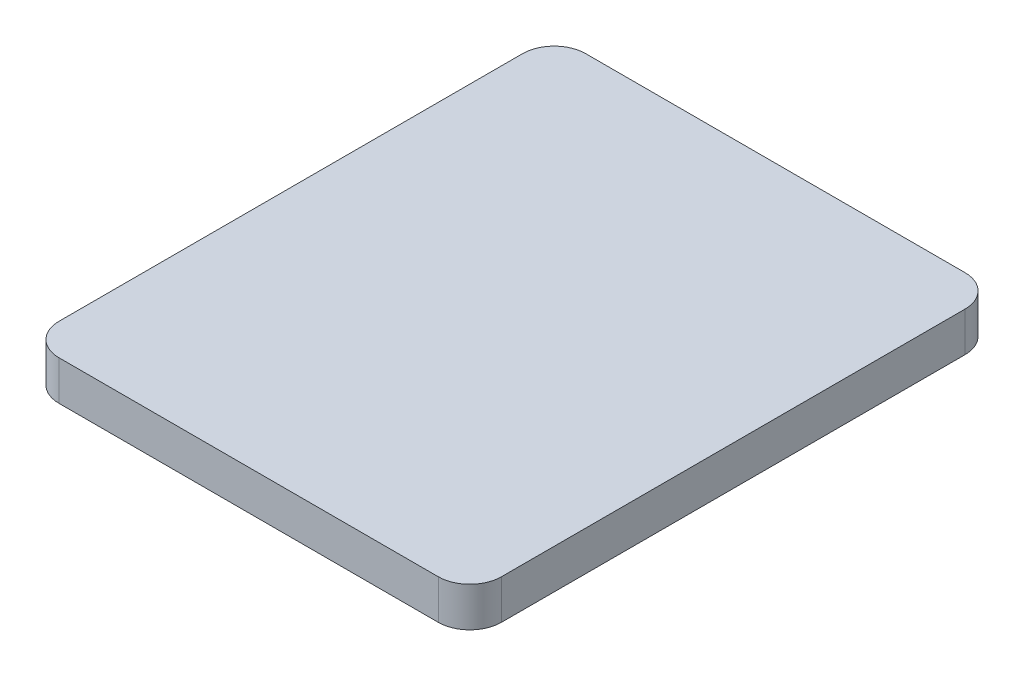
ISO-10303-21;
HEADER;
FILE_DESCRIPTION(('STEP AP214'),'2;1');
FILE_NAME('part.step','',(''),(''),'','','');
FILE_SCHEMA(('AUTOMOTIVE_DESIGN { 1 0 10303 214 1 1 1 1 }'));
ENDSEC;
DATA;
#1=APPLICATION_CONTEXT('core data for automotive mechanical design processes');
#2=APPLICATION_PROTOCOL_DEFINITION('international standard','automotive_design',2000,#1);
#3=PRODUCT_CONTEXT('',#1,'mechanical');
#4=PRODUCT('Part','Part','',(#3));
#5=PRODUCT_RELATED_PRODUCT_CATEGORY('part','',(#4));
#6=PRODUCT_DEFINITION_FORMATION('','',#4);
#7=PRODUCT_DEFINITION_CONTEXT('part definition',#1,'design');
#8=PRODUCT_DEFINITION('design','',#6,#7);
#9=PRODUCT_DEFINITION_SHAPE('','',#8);
#10=(LENGTH_UNIT() NAMED_UNIT(*) SI_UNIT(.MILLI.,.METRE.));
#11=(NAMED_UNIT(*) PLANE_ANGLE_UNIT() SI_UNIT($,.RADIAN.));
#12=(NAMED_UNIT(*) SI_UNIT($,.STERADIAN.) SOLID_ANGLE_UNIT());
#13=UNCERTAINTY_MEASURE_WITH_UNIT(LENGTH_MEASURE(1.E-05),#10,'distance_accuracy_value','');
#14=(GEOMETRIC_REPRESENTATION_CONTEXT(3) GLOBAL_UNCERTAINTY_ASSIGNED_CONTEXT((#13)) GLOBAL_UNIT_ASSIGNED_CONTEXT((#10,
#11,#12)) REPRESENTATION_CONTEXT('',''));
#15=CARTESIAN_POINT('',(0.,0.,0.));
#16=DIRECTION('',(0.,0.,1.));
#17=DIRECTION('',(1.,0.,0.));
#18=AXIS2_PLACEMENT_3D('',#15,#16,#17);
#19=CARTESIAN_POINT('',(0.,3.75,-50.));
#20=DIRECTION('',(1.,0.,0.));
#21=DIRECTION('',(0.,0.,-1.));
#22=AXIS2_PLACEMENT_3D('',#19,#20,#21);
#23=PLANE('',#22);
#24=DIRECTION('',(0.,0.,1.));
#25=VECTOR('',#24,1.);
#26=CARTESIAN_POINT('',(0.,3.75,-50.));
#27=LINE('',#26,#25);
#28=CARTESIAN_POINT('',(0.,3.75,-47.));
#29=VERTEX_POINT('',#28);
#30=CARTESIAN_POINT('',(0.,3.75,-3.));
#31=VERTEX_POINT('',#30);
#32=EDGE_CURVE('E119',#29,#31,#27,.T.);
#33=ORIENTED_EDGE('',*,*,#32,.F.);
#34=DIRECTION('',(0.,-1.,0.));
#35=VECTOR('',#34,1.);
#36=CARTESIAN_POINT('',(0.,3.75,-47.));
#37=LINE('',#36,#35);
#38=CARTESIAN_POINT('',(0.,0.,-47.));
#39=VERTEX_POINT('',#38);
#40=EDGE_CURVE('E104',#29,#39,#37,.T.);
#41=ORIENTED_EDGE('',*,*,#40,.T.);
#42=DIRECTION('',(0.,0.,1.));
#43=VECTOR('',#42,1.);
#44=CARTESIAN_POINT('',(0.,0.,-50.));
#45=LINE('',#44,#43);
#46=CARTESIAN_POINT('',(0.,0.,-3.));
#47=VERTEX_POINT('',#46);
#48=EDGE_CURVE('E116',#39,#47,#45,.T.);
#49=ORIENTED_EDGE('',*,*,#48,.T.);
#50=DIRECTION('',(0.,-1.,0.));
#51=VECTOR('',#50,1.);
#52=CARTESIAN_POINT('',(0.,3.75,-3.));
#53=LINE('',#52,#51);
#54=EDGE_CURVE('E121',#47,#31,#53,.F.);
#55=ORIENTED_EDGE('',*,*,#54,.T.);
#56=EDGE_LOOP('',(#33,#41,#49,#55));
#57=FACE_BOUND('',#56,.T.);
#58=ADVANCED_FACE('F33',(#57),#23,.F.);
#59=CARTESIAN_POINT('',(0.,3.75,0.));
#60=DIRECTION('',(0.,0.,-1.));
#61=DIRECTION('',(-1.,0.,0.));
#62=AXIS2_PLACEMENT_3D('',#59,#60,#61);
#63=PLANE('',#62);
#64=DIRECTION('',(1.,0.,0.));
#65=VECTOR('',#64,1.);
#66=CARTESIAN_POINT('',(0.,3.75,0.));
#67=LINE('',#66,#65);
#68=CARTESIAN_POINT('',(3.,3.75,0.));
#69=VERTEX_POINT('',#68);
#70=CARTESIAN_POINT('',(39.,3.75,0.));
#71=VERTEX_POINT('',#70);
#72=EDGE_CURVE('E159',#69,#71,#67,.T.);
#73=ORIENTED_EDGE('',*,*,#72,.F.);
#74=DIRECTION('',(0.,-1.,0.));
#75=VECTOR('',#74,1.);
#76=CARTESIAN_POINT('',(3.,3.75,0.));
#77=LINE('',#76,#75);
#78=CARTESIAN_POINT('',(3.,0.,0.));
#79=VERTEX_POINT('',#78);
#80=EDGE_CURVE('E11',#69,#79,#77,.T.);
#81=ORIENTED_EDGE('',*,*,#80,.T.);
#82=DIRECTION('',(1.,0.,0.));
#83=VECTOR('',#82,1.);
#84=CARTESIAN_POINT('',(0.,0.,0.));
#85=LINE('',#84,#83);
#86=CARTESIAN_POINT('',(39.,0.,0.));
#87=VERTEX_POINT('',#86);
#88=EDGE_CURVE('E126',#79,#87,#85,.T.);
#89=ORIENTED_EDGE('',*,*,#88,.T.);
#90=DIRECTION('',(0.,-1.,0.));
#91=VECTOR('',#90,1.);
#92=CARTESIAN_POINT('',(39.,3.75,0.));
#93=LINE('',#92,#91);
#94=EDGE_CURVE('E41',#87,#71,#93,.F.);
#95=ORIENTED_EDGE('',*,*,#94,.T.);
#96=EDGE_LOOP('',(#73,#81,#89,#95));
#97=FACE_BOUND('',#96,.T.);
#98=ADVANCED_FACE('F158',(#97),#63,.F.);
#99=CARTESIAN_POINT('',(42.,3.75,0.));
#100=DIRECTION('',(-1.,0.,0.));
#101=DIRECTION('',(0.,0.,1.));
#102=AXIS2_PLACEMENT_3D('',#99,#100,#101);
#103=PLANE('',#102);
#104=DIRECTION('',(0.,0.,-1.));
#105=VECTOR('',#104,1.);
#106=CARTESIAN_POINT('',(42.,0.,0.));
#107=LINE('',#106,#105);
#108=CARTESIAN_POINT('',(42.,0.,-3.));
#109=VERTEX_POINT('',#108);
#110=CARTESIAN_POINT('',(42.,0.,-47.));
#111=VERTEX_POINT('',#110);
#112=EDGE_CURVE('E129',#109,#111,#107,.T.);
#113=ORIENTED_EDGE('',*,*,#112,.T.);
#114=DIRECTION('',(0.,-1.,0.));
#115=VECTOR('',#114,1.);
#116=CARTESIAN_POINT('',(42.,3.75,-47.));
#117=LINE('',#116,#115);
#118=CARTESIAN_POINT('',(42.,3.75,-47.));
#119=VERTEX_POINT('',#118);
#120=EDGE_CURVE('E48',#111,#119,#117,.F.);
#121=ORIENTED_EDGE('',*,*,#120,.T.);
#122=DIRECTION('',(0.,0.,-1.));
#123=VECTOR('',#122,1.);
#124=CARTESIAN_POINT('',(42.,3.75,0.));
#125=LINE('',#124,#123);
#126=CARTESIAN_POINT('',(42.,3.75,-3.));
#127=VERTEX_POINT('',#126);
#128=EDGE_CURVE('E165',#127,#119,#125,.T.);
#129=ORIENTED_EDGE('',*,*,#128,.F.);
#130=DIRECTION('',(0.,-1.,0.));
#131=VECTOR('',#130,1.);
#132=CARTESIAN_POINT('',(42.,3.75,-3.));
#133=LINE('',#132,#131);
#134=EDGE_CURVE('E152',#127,#109,#133,.T.);
#135=ORIENTED_EDGE('',*,*,#134,.T.);
#136=EDGE_LOOP('',(#113,#121,#129,#135));
#137=FACE_BOUND('',#136,.T.);
#138=ADVANCED_FACE('F169',(#137),#103,.F.);
#139=CARTESIAN_POINT('',(42.,3.75,-50.));
#140=DIRECTION('',(0.,0.,1.));
#141=DIRECTION('',(1.,0.,0.));
#142=AXIS2_PLACEMENT_3D('',#139,#140,#141);
#143=PLANE('',#142);
#144=DIRECTION('',(-1.,0.,0.));
#145=VECTOR('',#144,1.);
#146=CARTESIAN_POINT('',(42.,0.,-50.));
#147=LINE('',#146,#145);
#148=CARTESIAN_POINT('',(39.,0.,-50.));
#149=VERTEX_POINT('',#148);
#150=CARTESIAN_POINT('',(3.,0.,-50.));
#151=VERTEX_POINT('',#150);
#152=EDGE_CURVE('E136',#149,#151,#147,.T.);
#153=ORIENTED_EDGE('',*,*,#152,.T.);
#154=DIRECTION('',(0.,-1.,0.));
#155=VECTOR('',#154,1.);
#156=CARTESIAN_POINT('',(3.,3.75,-50.));
#157=LINE('',#156,#155);
#158=CARTESIAN_POINT('',(3.,3.75,-50.));
#159=VERTEX_POINT('',#158);
#160=EDGE_CURVE('E105',#151,#159,#157,.F.);
#161=ORIENTED_EDGE('',*,*,#160,.T.);
#162=DIRECTION('',(-1.,0.,0.));
#163=VECTOR('',#162,1.);
#164=CARTESIAN_POINT('',(42.,3.75,-50.));
#165=LINE('',#164,#163);
#166=CARTESIAN_POINT('',(39.,3.75,-50.));
#167=VERTEX_POINT('',#166);
#168=EDGE_CURVE('E132',#167,#159,#165,.T.);
#169=ORIENTED_EDGE('',*,*,#168,.F.);
#170=DIRECTION('',(0.,-1.,0.));
#171=VECTOR('',#170,1.);
#172=CARTESIAN_POINT('',(39.,3.75,-50.));
#173=LINE('',#172,#171);
#174=EDGE_CURVE('E110',#167,#149,#173,.T.);
#175=ORIENTED_EDGE('',*,*,#174,.T.);
#176=EDGE_LOOP('',(#153,#161,#169,#175));
#177=FACE_BOUND('',#176,.T.);
#178=ADVANCED_FACE('F176',(#177),#143,.F.);
#179=CARTESIAN_POINT('',(0.,3.75,0.));
#180=DIRECTION('',(0.,1.,0.));
#181=DIRECTION('',(0.,0.,1.));
#182=AXIS2_PLACEMENT_3D('',#179,#180,#181);
#183=PLANE('',#182);
#184=ORIENTED_EDGE('',*,*,#168,.T.);
#185=CARTESIAN_POINT('',(3.,3.75,-47.));
#186=DIRECTION('',(0.,1.,0.));
#187=DIRECTION('',(0.,0.,1.));
#188=AXIS2_PLACEMENT_3D('',#185,#186,#187);
#189=CIRCLE('',#188,3.);
#190=EDGE_CURVE('E150',#159,#29,#189,.T.);
#191=ORIENTED_EDGE('',*,*,#190,.T.);
#192=ORIENTED_EDGE('',*,*,#32,.T.);
#193=CARTESIAN_POINT('',(3.,3.75,-3.));
#194=DIRECTION('',(0.,1.,0.));
#195=DIRECTION('',(0.,0.,1.));
#196=AXIS2_PLACEMENT_3D('',#193,#194,#195);
#197=CIRCLE('',#196,3.);
#198=EDGE_CURVE('E146',#31,#69,#197,.T.);
#199=ORIENTED_EDGE('',*,*,#198,.T.);
#200=ORIENTED_EDGE('',*,*,#72,.T.);
#201=CARTESIAN_POINT('',(39.,3.75,-3.));
#202=DIRECTION('',(0.,1.,0.));
#203=DIRECTION('',(0.,0.,1.));
#204=AXIS2_PLACEMENT_3D('',#201,#202,#203);
#205=CIRCLE('',#204,3.);
#206=EDGE_CURVE('E55',#71,#127,#205,.T.);
#207=ORIENTED_EDGE('',*,*,#206,.T.);
#208=ORIENTED_EDGE('',*,*,#128,.T.);
#209=CARTESIAN_POINT('',(39.,3.75,-47.));
#210=DIRECTION('',(0.,1.,0.));
#211=DIRECTION('',(0.,0.,1.));
#212=AXIS2_PLACEMENT_3D('',#209,#210,#211);
#213=CIRCLE('',#212,3.);
#214=EDGE_CURVE('E148',#119,#167,#213,.T.);
#215=ORIENTED_EDGE('',*,*,#214,.T.);
#216=EDGE_LOOP('',(#184,#191,#192,#199,#200,#207,#208,#215));
#217=FACE_BOUND('',#216,.T.);
#218=ADVANCED_FACE('F163',(#217),#183,.T.);
#219=CARTESIAN_POINT('',(0.,0.,0.));
#220=DIRECTION('',(0.,1.,0.));
#221=DIRECTION('',(0.,0.,1.));
#222=AXIS2_PLACEMENT_3D('',#219,#220,#221);
#223=PLANE('',#222);
#224=ORIENTED_EDGE('',*,*,#48,.F.);
#225=CARTESIAN_POINT('',(3.,0.,-47.));
#226=DIRECTION('',(0.,1.,0.));
#227=DIRECTION('',(0.,0.,1.));
#228=AXIS2_PLACEMENT_3D('',#225,#226,#227);
#229=CIRCLE('',#228,3.);
#230=EDGE_CURVE('E100',#39,#151,#229,.F.);
#231=ORIENTED_EDGE('',*,*,#230,.T.);
#232=ORIENTED_EDGE('',*,*,#152,.F.);
#233=CARTESIAN_POINT('',(39.,0.,-47.));
#234=DIRECTION('',(0.,1.,0.));
#235=DIRECTION('',(0.,0.,1.));
#236=AXIS2_PLACEMENT_3D('',#233,#234,#235);
#237=CIRCLE('',#236,3.);
#238=EDGE_CURVE('E111',#149,#111,#237,.F.);
#239=ORIENTED_EDGE('',*,*,#238,.T.);
#240=ORIENTED_EDGE('',*,*,#112,.F.);
#241=CARTESIAN_POINT('',(39.,0.,-3.));
#242=DIRECTION('',(0.,1.,0.));
#243=DIRECTION('',(0.,0.,1.));
#244=AXIS2_PLACEMENT_3D('',#241,#242,#243);
#245=CIRCLE('',#244,3.);
#246=EDGE_CURVE('E120',#109,#87,#245,.F.);
#247=ORIENTED_EDGE('',*,*,#246,.T.);
#248=ORIENTED_EDGE('',*,*,#88,.F.);
#249=CARTESIAN_POINT('',(3.,0.,-3.));
#250=DIRECTION('',(0.,1.,0.));
#251=DIRECTION('',(0.,0.,1.));
#252=AXIS2_PLACEMENT_3D('',#249,#250,#251);
#253=CIRCLE('',#252,3.);
#254=EDGE_CURVE('E125',#79,#47,#253,.F.);
#255=ORIENTED_EDGE('',*,*,#254,.T.);
#256=EDGE_LOOP('',(#224,#231,#232,#239,#240,#247,#248,#255));
#257=FACE_BOUND('',#256,.T.);
#258=ADVANCED_FACE('F123',(#257),#223,.F.);
#259=CARTESIAN_POINT('',(3.,3.75,-47.));
#260=DIRECTION('',(0.,-1.,0.));
#261=DIRECTION('',(0.,0.,-1.));
#262=AXIS2_PLACEMENT_3D('',#259,#260,#261);
#263=CYLINDRICAL_SURFACE('',#262,3.);
#264=ORIENTED_EDGE('',*,*,#190,.F.);
#265=ORIENTED_EDGE('',*,*,#160,.F.);
#266=ORIENTED_EDGE('',*,*,#230,.F.);
#267=ORIENTED_EDGE('',*,*,#40,.F.);
#268=EDGE_LOOP('',(#264,#265,#266,#267));
#269=FACE_BOUND('',#268,.T.);
#270=ADVANCED_FACE('F103',(#269),#263,.T.);
#271=CARTESIAN_POINT('',(39.,3.75,-47.));
#272=DIRECTION('',(0.,-1.,0.));
#273=DIRECTION('',(0.,0.,-1.));
#274=AXIS2_PLACEMENT_3D('',#271,#272,#273);
#275=CYLINDRICAL_SURFACE('',#274,3.);
#276=ORIENTED_EDGE('',*,*,#214,.F.);
#277=ORIENTED_EDGE('',*,*,#120,.F.);
#278=ORIENTED_EDGE('',*,*,#238,.F.);
#279=ORIENTED_EDGE('',*,*,#174,.F.);
#280=EDGE_LOOP('',(#276,#277,#278,#279));
#281=FACE_BOUND('',#280,.T.);
#282=ADVANCED_FACE('F173',(#281),#275,.T.);
#283=CARTESIAN_POINT('',(3.,3.75,-3.));
#284=DIRECTION('',(0.,-1.,0.));
#285=DIRECTION('',(0.,0.,-1.));
#286=AXIS2_PLACEMENT_3D('',#283,#284,#285);
#287=CYLINDRICAL_SURFACE('',#286,3.);
#288=ORIENTED_EDGE('',*,*,#198,.F.);
#289=ORIENTED_EDGE('',*,*,#54,.F.);
#290=ORIENTED_EDGE('',*,*,#254,.F.);
#291=ORIENTED_EDGE('',*,*,#80,.F.);
#292=EDGE_LOOP('',(#288,#289,#290,#291));
#293=FACE_BOUND('',#292,.T.);
#294=ADVANCED_FACE('F179',(#293),#287,.T.);
#295=CARTESIAN_POINT('',(39.,3.75,-3.));
#296=DIRECTION('',(0.,-1.,0.));
#297=DIRECTION('',(0.,0.,-1.));
#298=AXIS2_PLACEMENT_3D('',#295,#296,#297);
#299=CYLINDRICAL_SURFACE('',#298,3.);
#300=ORIENTED_EDGE('',*,*,#206,.F.);
#301=ORIENTED_EDGE('',*,*,#94,.F.);
#302=ORIENTED_EDGE('',*,*,#246,.F.);
#303=ORIENTED_EDGE('',*,*,#134,.F.);
#304=EDGE_LOOP('',(#300,#301,#302,#303));
#305=FACE_BOUND('',#304,.T.);
#306=ADVANCED_FACE('F35',(#305),#299,.T.);
#307=CLOSED_SHELL('',(#58,#98,#138,#178,#218,#258,#270,#282,#294,#306));
#308=MANIFOLD_SOLID_BREP('B2',#307);
#309=ADVANCED_BREP_SHAPE_REPRESENTATION('',(#18,#308),#14);
#310=SHAPE_DEFINITION_REPRESENTATION(#9,#309);
ENDSEC;
END-ISO-10303-21;
